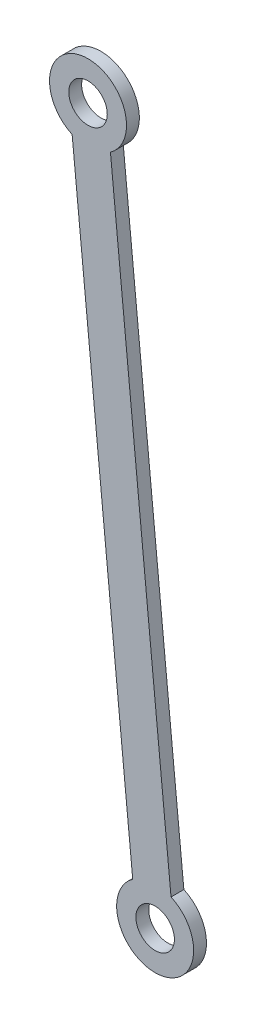
ISO-10303-21;
HEADER;
FILE_DESCRIPTION(('STEP AP214'),'2;1');
FILE_NAME('part.step','',(''),(''),'','','');
FILE_SCHEMA(('AUTOMOTIVE_DESIGN { 1 0 10303 214 1 1 1 1 }'));
ENDSEC;
DATA;
#1=APPLICATION_CONTEXT('core data for automotive mechanical design processes');
#2=APPLICATION_PROTOCOL_DEFINITION('international standard','automotive_design',2000,#1);
#3=PRODUCT_CONTEXT('',#1,'mechanical');
#4=PRODUCT('Part','Part','',(#3));
#5=PRODUCT_RELATED_PRODUCT_CATEGORY('part','',(#4));
#6=PRODUCT_DEFINITION_FORMATION('','',#4);
#7=PRODUCT_DEFINITION_CONTEXT('part definition',#1,'design');
#8=PRODUCT_DEFINITION('design','',#6,#7);
#9=PRODUCT_DEFINITION_SHAPE('','',#8);
#10=(LENGTH_UNIT() NAMED_UNIT(*) SI_UNIT(.MILLI.,.METRE.));
#11=(NAMED_UNIT(*) PLANE_ANGLE_UNIT() SI_UNIT($,.RADIAN.));
#12=(NAMED_UNIT(*) SI_UNIT($,.STERADIAN.) SOLID_ANGLE_UNIT());
#13=UNCERTAINTY_MEASURE_WITH_UNIT(LENGTH_MEASURE(1.E-05),#10,'distance_accuracy_value','');
#14=(GEOMETRIC_REPRESENTATION_CONTEXT(3) GLOBAL_UNCERTAINTY_ASSIGNED_CONTEXT((#13)) GLOBAL_UNIT_ASSIGNED_CONTEXT((#10,
#11,#12)) REPRESENTATION_CONTEXT('',''));
#15=CARTESIAN_POINT('',(0.,0.,0.));
#16=DIRECTION('',(0.,0.,1.));
#17=DIRECTION('',(1.,0.,0.));
#18=AXIS2_PLACEMENT_3D('',#15,#16,#17);
#19=CARTESIAN_POINT('',(33.7318338504805,59.8602684425623,-3.));
#20=DIRECTION('',(0.,0.,1.));
#21=DIRECTION('',(1.,0.,0.));
#22=AXIS2_PLACEMENT_3D('',#19,#20,#21);
#23=CYLINDRICAL_SURFACE('',#22,9.00000000000005);
#24=CARTESIAN_POINT('',(33.7318338504805,59.8602684425623,0.));
#25=DIRECTION('',(0.,0.,1.));
#26=DIRECTION('',(1.,0.,0.));
#27=AXIS2_PLACEMENT_3D('',#24,#25,#26);
#28=CIRCLE('',#27,9.00000000000005);
#29=CARTESIAN_POINT('',(28.4891529133719,67.1756150913329,0.));
#30=VERTEX_POINT('',#29);
#31=CARTESIAN_POINT('',(37.4457694172509,68.05823664242,0.));
#32=VERTEX_POINT('',#31);
#33=EDGE_CURVE('E107',#30,#32,#28,.T.);
#34=ORIENTED_EDGE('',*,*,#33,.F.);
#35=DIRECTION('',(0.,0.,1.));
#36=VECTOR('',#35,1.);
#37=CARTESIAN_POINT('',(28.4891529133719,67.1756150913329,-3.));
#38=LINE('',#37,#36);
#39=CARTESIAN_POINT('',(28.4891529133719,67.1756150913329,-3.));
#40=VERTEX_POINT('',#39);
#41=EDGE_CURVE('E11',#40,#30,#38,.T.);
#42=ORIENTED_EDGE('',*,*,#41,.F.);
#43=CARTESIAN_POINT('',(33.7318338504805,59.8602684425623,-3.));
#44=DIRECTION('',(0.,0.,1.));
#45=DIRECTION('',(1.,0.,0.));
#46=AXIS2_PLACEMENT_3D('',#43,#44,#45);
#47=CIRCLE('',#46,9.00000000000005);
#48=CARTESIAN_POINT('',(37.4457694172509,68.05823664242,-3.));
#49=VERTEX_POINT('',#48);
#50=EDGE_CURVE('E95',#40,#49,#47,.T.);
#51=ORIENTED_EDGE('',*,*,#50,.T.);
#52=DIRECTION('',(0.,0.,1.));
#53=VECTOR('',#52,1.);
#54=CARTESIAN_POINT('',(37.4457694172509,68.05823664242,-3.));
#55=LINE('',#54,#53);
#56=EDGE_CURVE('E38',#49,#32,#55,.T.);
#57=ORIENTED_EDGE('',*,*,#56,.T.);
#58=EDGE_LOOP('',(#34,#42,#51,#57));
#59=FACE_BOUND('',#58,.T.);
#60=ADVANCED_FACE('F35',(#59),#23,.T.);
#61=CARTESIAN_POINT('',(34.771250839643,3.42650099354315,-3.));
#62=DIRECTION('',(0.995179611542104,0.0980690612319058,0.));
#63=DIRECTION('',(-0.0980690612319059,0.995179611542104,0.));
#64=AXIS2_PLACEMENT_3D('',#61,#62,#63);
#65=PLANE('',#64);
#66=DIRECTION('',(-0.0980690612319059,0.995179611542104,0.));
#67=VECTOR('',#66,1.);
#68=CARTESIAN_POINT('',(34.771250839643,3.42650099354315,0.));
#69=LINE('',#68,#67);
#70=CARTESIAN_POINT('',(14.3268484866052,210.891038089441,0.));
#71=VERTEX_POINT('',#70);
#72=EDGE_CURVE('E113',#30,#71,#69,.T.);
#73=ORIENTED_EDGE('',*,*,#72,.T.);
#74=DIRECTION('',(0.,0.,1.));
#75=VECTOR('',#74,1.);
#76=CARTESIAN_POINT('',(14.3268484866052,210.891038089441,-3.));
#77=LINE('',#76,#75);
#78=CARTESIAN_POINT('',(14.3268484866052,210.891038089441,-3.));
#79=VERTEX_POINT('',#78);
#80=EDGE_CURVE('E44',#79,#71,#77,.T.);
#81=ORIENTED_EDGE('',*,*,#80,.F.);
#82=DIRECTION('',(-0.0980690612319059,0.995179611542104,0.));
#83=VECTOR('',#82,1.);
#84=CARTESIAN_POINT('',(34.771250839643,3.42650099354315,-3.));
#85=LINE('',#84,#83);
#86=EDGE_CURVE('E92',#40,#79,#85,.T.);
#87=ORIENTED_EDGE('',*,*,#86,.F.);
#88=ORIENTED_EDGE('',*,*,#41,.T.);
#89=EDGE_LOOP('',(#73,#81,#87,#88));
#90=FACE_BOUND('',#89,.T.);
#91=ADVANCED_FACE('F135',(#90),#65,.F.);
#92=CARTESIAN_POINT('',(18.0407840533756,219.089006289299,-3.));
#93=DIRECTION('',(0.,0.,1.));
#94=DIRECTION('',(1.,0.,0.));
#95=AXIS2_PLACEMENT_3D('',#92,#93,#94);
#96=CYLINDRICAL_SURFACE('',#95,9.00000000000002);
#97=CARTESIAN_POINT('',(18.0407840533756,219.089006289299,0.));
#98=DIRECTION('',(0.,0.,1.));
#99=DIRECTION('',(1.,0.,0.));
#100=AXIS2_PLACEMENT_3D('',#97,#98,#99);
#101=CIRCLE('',#100,9.00000000000002);
#102=CARTESIAN_POINT('',(23.2834649904842,211.773659640528,0.));
#103=VERTEX_POINT('',#102);
#104=EDGE_CURVE('E85',#103,#71,#101,.T.);
#105=ORIENTED_EDGE('',*,*,#104,.F.);
#106=DIRECTION('',(0.,0.,1.));
#107=VECTOR('',#106,1.);
#108=CARTESIAN_POINT('',(23.2834649904842,211.773659640528,-3.));
#109=LINE('',#108,#107);
#110=CARTESIAN_POINT('',(23.2834649904842,211.773659640528,-3.));
#111=VERTEX_POINT('',#110);
#112=EDGE_CURVE('E80',#111,#103,#109,.T.);
#113=ORIENTED_EDGE('',*,*,#112,.F.);
#114=CARTESIAN_POINT('',(18.0407840533756,219.089006289299,-3.));
#115=DIRECTION('',(0.,0.,1.));
#116=DIRECTION('',(1.,0.,0.));
#117=AXIS2_PLACEMENT_3D('',#114,#115,#116);
#118=CIRCLE('',#117,9.00000000000002);
#119=EDGE_CURVE('E83',#111,#79,#118,.T.);
#120=ORIENTED_EDGE('',*,*,#119,.T.);
#121=ORIENTED_EDGE('',*,*,#80,.T.);
#122=EDGE_LOOP('',(#105,#113,#120,#121));
#123=FACE_BOUND('',#122,.T.);
#124=ADVANCED_FACE('F82',(#123),#96,.T.);
#125=CARTESIAN_POINT('',(18.0407840533756,219.089006289299,-3.));
#126=DIRECTION('',(0.,0.,1.));
#127=DIRECTION('',(1.,0.,0.));
#128=AXIS2_PLACEMENT_3D('',#125,#126,#127);
#129=CYLINDRICAL_SURFACE('',#128,4.5);
#130=CARTESIAN_POINT('',(18.0407840533756,219.089006289299,-3.));
#131=DIRECTION('',(0.,0.,1.));
#132=DIRECTION('',(1.,0.,0.));
#133=AXIS2_PLACEMENT_3D('',#130,#131,#132);
#134=CIRCLE('',#133,4.5);
#135=CARTESIAN_POINT('',(22.5407840533756,219.089006289299,-3.));
#136=VERTEX_POINT('',#135);
#137=EDGE_CURVE('E101',#136,#136,#134,.T.);
#138=ORIENTED_EDGE('',*,*,#137,.F.);
#139=EDGE_LOOP('',(#138));
#140=FACE_BOUND('',#139,.T.);
#141=CARTESIAN_POINT('',(18.0407840533756,219.089006289299,0.));
#142=DIRECTION('',(0.,0.,1.));
#143=DIRECTION('',(1.,0.,0.));
#144=AXIS2_PLACEMENT_3D('',#141,#142,#143);
#145=CIRCLE('',#144,4.5);
#146=CARTESIAN_POINT('',(22.5407840533756,219.089006289299,0.));
#147=VERTEX_POINT('',#146);
#148=EDGE_CURVE('E115',#147,#147,#145,.T.);
#149=ORIENTED_EDGE('',*,*,#148,.T.);
#150=EDGE_LOOP('',(#149));
#151=FACE_BOUND('',#150,.T.);
#152=ADVANCED_FACE('F143',(#140,#151),#129,.F.);
#153=CARTESIAN_POINT('',(43.727867343522,4.30912254463031,-3.));
#154=DIRECTION('',(0.995179611542104,0.0980690612319059,0.));
#155=DIRECTION('',(-0.0980690612319059,0.995179611542104,0.));
#156=AXIS2_PLACEMENT_3D('',#153,#154,#155);
#157=PLANE('',#156);
#158=DIRECTION('',(-0.0980690612319059,0.995179611542104,0.));
#159=VECTOR('',#158,1.);
#160=CARTESIAN_POINT('',(43.727867343522,4.30912254463031,0.));
#161=LINE('',#160,#159);
#162=EDGE_CURVE('E110',#32,#103,#161,.T.);
#163=ORIENTED_EDGE('',*,*,#162,.F.);
#164=ORIENTED_EDGE('',*,*,#56,.F.);
#165=DIRECTION('',(-0.0980690612319059,0.995179611542104,0.));
#166=VECTOR('',#165,1.);
#167=CARTESIAN_POINT('',(43.727867343522,4.30912254463031,-3.));
#168=LINE('',#167,#166);
#169=EDGE_CURVE('E91',#49,#111,#168,.T.);
#170=ORIENTED_EDGE('',*,*,#169,.T.);
#171=ORIENTED_EDGE('',*,*,#112,.T.);
#172=EDGE_LOOP('',(#163,#164,#170,#171));
#173=FACE_BOUND('',#172,.T.);
#174=ADVANCED_FACE('F94',(#173),#157,.T.);
#175=CARTESIAN_POINT('',(33.7318338504805,59.8602684425623,-3.));
#176=DIRECTION('',(0.,0.,1.));
#177=DIRECTION('',(1.,0.,0.));
#178=AXIS2_PLACEMENT_3D('',#175,#176,#177);
#179=CYLINDRICAL_SURFACE('',#178,4.50000000000001);
#180=CARTESIAN_POINT('',(33.7318338504805,59.8602684425623,-3.));
#181=DIRECTION('',(0.,0.,1.));
#182=DIRECTION('',(1.,0.,0.));
#183=AXIS2_PLACEMENT_3D('',#180,#181,#182);
#184=CIRCLE('',#183,4.50000000000001);
#185=CARTESIAN_POINT('',(38.2318338504805,59.8602684425623,-3.));
#186=VERTEX_POINT('',#185);
#187=EDGE_CURVE('E104',#186,#186,#184,.T.);
#188=ORIENTED_EDGE('',*,*,#187,.F.);
#189=EDGE_LOOP('',(#188));
#190=FACE_BOUND('',#189,.T.);
#191=CARTESIAN_POINT('',(33.7318338504805,59.8602684425623,0.));
#192=DIRECTION('',(0.,0.,1.));
#193=DIRECTION('',(1.,0.,0.));
#194=AXIS2_PLACEMENT_3D('',#191,#192,#193);
#195=CIRCLE('',#194,4.50000000000001);
#196=CARTESIAN_POINT('',(38.2318338504805,59.8602684425623,0.));
#197=VERTEX_POINT('',#196);
#198=EDGE_CURVE('E97',#197,#197,#195,.T.);
#199=ORIENTED_EDGE('',*,*,#198,.T.);
#200=EDGE_LOOP('',(#199));
#201=FACE_BOUND('',#200,.T.);
#202=ADVANCED_FACE('F122',(#190,#201),#179,.F.);
#203=CARTESIAN_POINT('',(0.,0.,-3.));
#204=DIRECTION('',(0.,0.,1.));
#205=DIRECTION('',(1.,0.,0.));
#206=AXIS2_PLACEMENT_3D('',#203,#204,#205);
#207=PLANE('',#206);
#208=ORIENTED_EDGE('',*,*,#50,.F.);
#209=ORIENTED_EDGE('',*,*,#86,.T.);
#210=ORIENTED_EDGE('',*,*,#119,.F.);
#211=ORIENTED_EDGE('',*,*,#169,.F.);
#212=EDGE_LOOP('',(#208,#209,#210,#211));
#213=FACE_BOUND('',#212,.T.);
#214=ORIENTED_EDGE('',*,*,#137,.T.);
#215=EDGE_LOOP('',(#214));
#216=FACE_BOUND('',#215,.T.);
#217=ORIENTED_EDGE('',*,*,#187,.T.);
#218=EDGE_LOOP('',(#217));
#219=FACE_BOUND('',#218,.T.);
#220=ADVANCED_FACE('F89',(#213,#216,#219),#207,.F.);
#221=CARTESIAN_POINT('',(0.,0.,0.));
#222=DIRECTION('',(0.,0.,1.));
#223=DIRECTION('',(1.,0.,0.));
#224=AXIS2_PLACEMENT_3D('',#221,#222,#223);
#225=PLANE('',#224);
#226=ORIENTED_EDGE('',*,*,#33,.T.);
#227=ORIENTED_EDGE('',*,*,#162,.T.);
#228=ORIENTED_EDGE('',*,*,#104,.T.);
#229=ORIENTED_EDGE('',*,*,#72,.F.);
#230=EDGE_LOOP('',(#226,#227,#228,#229));
#231=FACE_BOUND('',#230,.T.);
#232=ORIENTED_EDGE('',*,*,#148,.F.);
#233=EDGE_LOOP('',(#232));
#234=FACE_BOUND('',#233,.T.);
#235=ORIENTED_EDGE('',*,*,#198,.F.);
#236=EDGE_LOOP('',(#235));
#237=FACE_BOUND('',#236,.T.);
#238=ADVANCED_FACE('F124',(#231,#234,#237),#225,.T.);
#239=CLOSED_SHELL('',(#60,#91,#124,#152,#174,#202,#220,#238));
#240=MANIFOLD_SOLID_BREP('B2',#239);
#241=ADVANCED_BREP_SHAPE_REPRESENTATION('',(#18,#240),#14);
#242=SHAPE_DEFINITION_REPRESENTATION(#9,#241);
ENDSEC;
END-ISO-10303-21;
